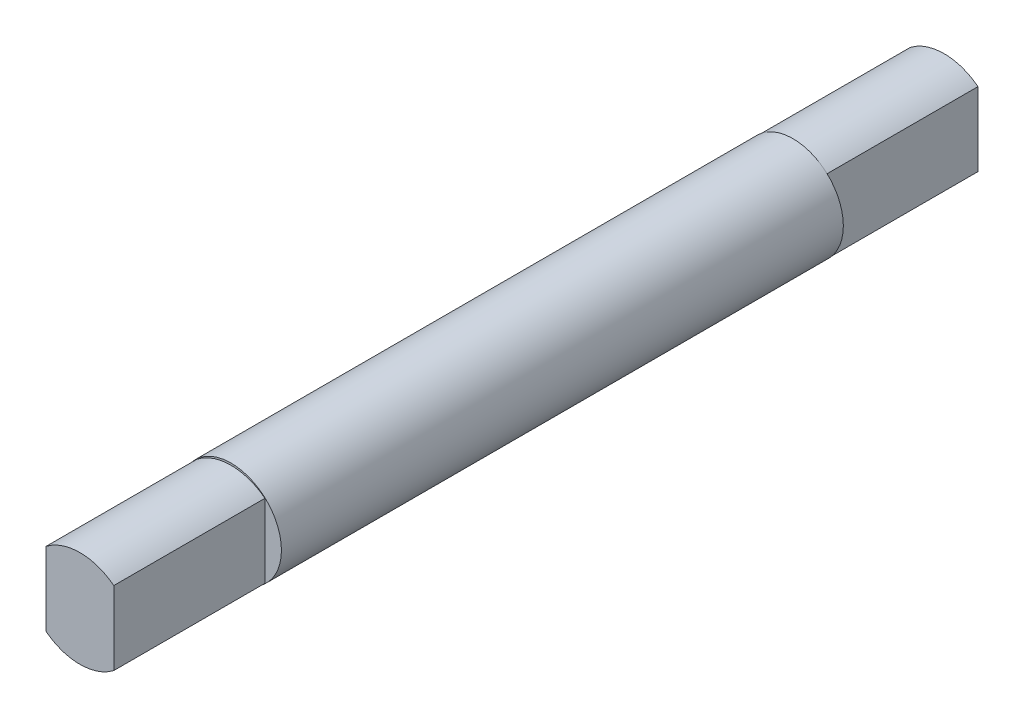
ISO-10303-21;
HEADER;
FILE_DESCRIPTION(('STEP AP214'),'2;1');
FILE_NAME('part.step','',(''),(''),'','','');
FILE_SCHEMA(('AUTOMOTIVE_DESIGN { 1 0 10303 214 1 1 1 1 }'));
ENDSEC;
DATA;
#1=APPLICATION_CONTEXT('core data for automotive mechanical design processes');
#2=APPLICATION_PROTOCOL_DEFINITION('international standard','automotive_design',2000,#1);
#3=PRODUCT_CONTEXT('',#1,'mechanical');
#4=PRODUCT('Part','Part','',(#3));
#5=PRODUCT_RELATED_PRODUCT_CATEGORY('part','',(#4));
#6=PRODUCT_DEFINITION_FORMATION('','',#4);
#7=PRODUCT_DEFINITION_CONTEXT('part definition',#1,'design');
#8=PRODUCT_DEFINITION('design','',#6,#7);
#9=PRODUCT_DEFINITION_SHAPE('','',#8);
#10=(LENGTH_UNIT() NAMED_UNIT(*) SI_UNIT(.MILLI.,.METRE.));
#11=(NAMED_UNIT(*) PLANE_ANGLE_UNIT() SI_UNIT($,.RADIAN.));
#12=(NAMED_UNIT(*) SI_UNIT($,.STERADIAN.) SOLID_ANGLE_UNIT());
#13=UNCERTAINTY_MEASURE_WITH_UNIT(LENGTH_MEASURE(1.E-05),#10,'distance_accuracy_value','');
#14=(GEOMETRIC_REPRESENTATION_CONTEXT(3) GLOBAL_UNCERTAINTY_ASSIGNED_CONTEXT((#13)) GLOBAL_UNIT_ASSIGNED_CONTEXT((#10,
#11,#12)) REPRESENTATION_CONTEXT('',''));
#15=CARTESIAN_POINT('',(0.,0.,0.));
#16=DIRECTION('',(0.,0.,1.));
#17=DIRECTION('',(1.,0.,0.));
#18=AXIS2_PLACEMENT_3D('',#15,#16,#17);
#19=CARTESIAN_POINT('',(0.,0.,0.));
#20=DIRECTION('',(0.,0.,1.));
#21=DIRECTION('',(1.,0.,0.));
#22=AXIS2_PLACEMENT_3D('',#19,#20,#21);
#23=PLANE('',#22);
#24=CARTESIAN_POINT('',(0.,0.,0.));
#25=DIRECTION('',(0.,0.,1.));
#26=DIRECTION('',(1.,0.,0.));
#27=AXIS2_PLACEMENT_3D('',#24,#25,#26);
#28=CIRCLE('',#27,2.6);
#29=CARTESIAN_POINT('',(2.6,0.,0.));
#30=VERTEX_POINT('',#29);
#31=EDGE_CURVE('E11',#30,#30,#28,.T.);
#32=ORIENTED_EDGE('',*,*,#31,.T.);
#33=EDGE_LOOP('',(#32));
#34=FACE_BOUND('',#33,.T.);
#35=DIRECTION('',(0.,-1.,0.));
#36=VECTOR('',#35,1.);
#37=CARTESIAN_POINT('',(-1.75,1.9,0.));
#38=LINE('',#37,#36);
#39=CARTESIAN_POINT('',(-1.75,1.9,0.));
#40=VERTEX_POINT('',#39);
#41=CARTESIAN_POINT('',(-1.75,-1.9,0.));
#42=VERTEX_POINT('',#41);
#43=EDGE_CURVE('E137',#40,#42,#38,.T.);
#44=ORIENTED_EDGE('',*,*,#43,.F.);
#45=CARTESIAN_POINT('',(0.,-0.352083333333338,0.));
#46=DIRECTION('',(0.,0.,-1.));
#47=DIRECTION('',(-1.,0.,0.));
#48=AXIS2_PLACEMENT_3D('',#45,#46,#47);
#49=CIRCLE('',#48,2.85208333333334);
#50=CARTESIAN_POINT('',(1.75,1.9,0.));
#51=VERTEX_POINT('',#50);
#52=EDGE_CURVE('E50',#40,#51,#49,.T.);
#53=ORIENTED_EDGE('',*,*,#52,.T.);
#54=DIRECTION('',(0.,-1.,0.));
#55=VECTOR('',#54,1.);
#56=CARTESIAN_POINT('',(1.75,1.9,0.));
#57=LINE('',#56,#55);
#58=CARTESIAN_POINT('',(1.75,-1.9,0.));
#59=VERTEX_POINT('',#58);
#60=EDGE_CURVE('E55',#51,#59,#57,.T.);
#61=ORIENTED_EDGE('',*,*,#60,.T.);
#62=CARTESIAN_POINT('',(0.,0.352083333333334,0.));
#63=DIRECTION('',(0.,0.,1.));
#64=DIRECTION('',(1.,0.,0.));
#65=AXIS2_PLACEMENT_3D('',#62,#63,#64);
#66=CIRCLE('',#65,2.85208333333333);
#67=EDGE_CURVE('E147',#42,#59,#66,.T.);
#68=ORIENTED_EDGE('',*,*,#67,.F.);
#69=EDGE_LOOP('',(#44,#53,#61,#68));
#70=FACE_BOUND('',#69,.T.);
#71=ADVANCED_FACE('F35',(#34,#70),#23,.T.);
#72=CARTESIAN_POINT('',(0.,0.,0.));
#73=DIRECTION('',(0.,0.,1.));
#74=DIRECTION('',(1.,0.,0.));
#75=AXIS2_PLACEMENT_3D('',#72,#73,#74);
#76=CYLINDRICAL_SURFACE('',#75,2.6);
#77=ORIENTED_EDGE('',*,*,#31,.F.);
#78=EDGE_LOOP('',(#77));
#79=FACE_BOUND('',#78,.T.);
#80=CARTESIAN_POINT('',(0.,0.,-29.));
#81=DIRECTION('',(0.,0.,1.));
#82=DIRECTION('',(1.,0.,0.));
#83=AXIS2_PLACEMENT_3D('',#80,#81,#82);
#84=CIRCLE('',#83,2.6);
#85=CARTESIAN_POINT('',(2.6,0.,-29.));
#86=VERTEX_POINT('',#85);
#87=EDGE_CURVE('E129',#86,#86,#84,.T.);
#88=ORIENTED_EDGE('',*,*,#87,.T.);
#89=EDGE_LOOP('',(#88));
#90=FACE_BOUND('',#89,.T.);
#91=ADVANCED_FACE('F37',(#79,#90),#76,.T.);
#92=CARTESIAN_POINT('',(0.,-0.352083333333338,7.8));
#93=DIRECTION('',(0.,0.,-1.));
#94=DIRECTION('',(-1.,0.,0.));
#95=AXIS2_PLACEMENT_3D('',#92,#93,#94);
#96=CYLINDRICAL_SURFACE('',#95,2.85208333333334);
#97=ORIENTED_EDGE('',*,*,#52,.F.);
#98=DIRECTION('',(0.,0.,-1.));
#99=VECTOR('',#98,1.);
#100=CARTESIAN_POINT('',(-1.75,1.9,7.8));
#101=LINE('',#100,#99);
#102=CARTESIAN_POINT('',(-1.75,1.9,7.8));
#103=VERTEX_POINT('',#102);
#104=EDGE_CURVE('E43',#103,#40,#101,.T.);
#105=ORIENTED_EDGE('',*,*,#104,.F.);
#106=CARTESIAN_POINT('',(0.,-0.352083333333338,7.8));
#107=DIRECTION('',(0.,0.,-1.));
#108=DIRECTION('',(-1.,0.,0.));
#109=AXIS2_PLACEMENT_3D('',#106,#107,#108);
#110=CIRCLE('',#109,2.85208333333334);
#111=CARTESIAN_POINT('',(1.75,1.9,7.8));
#112=VERTEX_POINT('',#111);
#113=EDGE_CURVE('E133',#103,#112,#110,.T.);
#114=ORIENTED_EDGE('',*,*,#113,.T.);
#115=DIRECTION('',(0.,0.,-1.));
#116=VECTOR('',#115,1.);
#117=CARTESIAN_POINT('',(1.75,1.9,7.8));
#118=LINE('',#117,#116);
#119=EDGE_CURVE('E144',#112,#51,#118,.T.);
#120=ORIENTED_EDGE('',*,*,#119,.T.);
#121=EDGE_LOOP('',(#97,#105,#114,#120));
#122=FACE_BOUND('',#121,.T.);
#123=ADVANCED_FACE('F159',(#122),#96,.T.);
#124=CARTESIAN_POINT('',(-1.75,1.9,7.8));
#125=DIRECTION('',(1.,0.,0.));
#126=DIRECTION('',(0.,1.,0.));
#127=AXIS2_PLACEMENT_3D('',#124,#125,#126);
#128=PLANE('',#127);
#129=ORIENTED_EDGE('',*,*,#43,.T.);
#130=DIRECTION('',(0.,0.,-1.));
#131=VECTOR('',#130,1.);
#132=CARTESIAN_POINT('',(-1.75,-1.9,7.8));
#133=LINE('',#132,#131);
#134=CARTESIAN_POINT('',(-1.75,-1.9,7.8));
#135=VERTEX_POINT('',#134);
#136=EDGE_CURVE('E154',#135,#42,#133,.T.);
#137=ORIENTED_EDGE('',*,*,#136,.F.);
#138=DIRECTION('',(0.,-1.,0.));
#139=VECTOR('',#138,1.);
#140=CARTESIAN_POINT('',(-1.75,1.9,7.8));
#141=LINE('',#140,#139);
#142=EDGE_CURVE('E142',#103,#135,#141,.T.);
#143=ORIENTED_EDGE('',*,*,#142,.F.);
#144=ORIENTED_EDGE('',*,*,#104,.T.);
#145=EDGE_LOOP('',(#129,#137,#143,#144));
#146=FACE_BOUND('',#145,.T.);
#147=ADVANCED_FACE('F170',(#146),#128,.F.);
#148=CARTESIAN_POINT('',(0.,0.352083333333334,7.8));
#149=DIRECTION('',(0.,0.,-1.));
#150=DIRECTION('',(-1.,0.,0.));
#151=AXIS2_PLACEMENT_3D('',#148,#149,#150);
#152=CYLINDRICAL_SURFACE('',#151,2.85208333333333);
#153=ORIENTED_EDGE('',*,*,#67,.T.);
#154=DIRECTION('',(0.,0.,-1.));
#155=VECTOR('',#154,1.);
#156=CARTESIAN_POINT('',(1.75,-1.9,7.8));
#157=LINE('',#156,#155);
#158=CARTESIAN_POINT('',(1.75,-1.9,7.8));
#159=VERTEX_POINT('',#158);
#160=EDGE_CURVE('E157',#159,#59,#157,.T.);
#161=ORIENTED_EDGE('',*,*,#160,.F.);
#162=CARTESIAN_POINT('',(0.,0.352083333333334,7.8));
#163=DIRECTION('',(0.,0.,1.));
#164=DIRECTION('',(1.,0.,0.));
#165=AXIS2_PLACEMENT_3D('',#162,#163,#164);
#166=CIRCLE('',#165,2.85208333333333);
#167=EDGE_CURVE('E140',#135,#159,#166,.T.);
#168=ORIENTED_EDGE('',*,*,#167,.F.);
#169=ORIENTED_EDGE('',*,*,#136,.T.);
#170=EDGE_LOOP('',(#153,#161,#168,#169));
#171=FACE_BOUND('',#170,.T.);
#172=ADVANCED_FACE('F167',(#171),#152,.T.);
#173=CARTESIAN_POINT('',(1.75,1.9,7.8));
#174=DIRECTION('',(1.,0.,0.));
#175=DIRECTION('',(0.,1.,0.));
#176=AXIS2_PLACEMENT_3D('',#173,#174,#175);
#177=PLANE('',#176);
#178=ORIENTED_EDGE('',*,*,#60,.F.);
#179=ORIENTED_EDGE('',*,*,#119,.F.);
#180=DIRECTION('',(0.,-1.,0.));
#181=VECTOR('',#180,1.);
#182=CARTESIAN_POINT('',(1.75,1.9,7.8));
#183=LINE('',#182,#181);
#184=EDGE_CURVE('E136',#112,#159,#183,.T.);
#185=ORIENTED_EDGE('',*,*,#184,.T.);
#186=ORIENTED_EDGE('',*,*,#160,.T.);
#187=EDGE_LOOP('',(#178,#179,#185,#186));
#188=FACE_BOUND('',#187,.T.);
#189=ADVANCED_FACE('F163',(#188),#177,.T.);
#190=CARTESIAN_POINT('',(0.,-0.352083333333338,7.8));
#191=DIRECTION('',(0.,0.,-1.));
#192=DIRECTION('',(-1.,0.,0.));
#193=AXIS2_PLACEMENT_3D('',#190,#191,#192);
#194=PLANE('',#193);
#195=ORIENTED_EDGE('',*,*,#113,.F.);
#196=ORIENTED_EDGE('',*,*,#142,.T.);
#197=ORIENTED_EDGE('',*,*,#167,.T.);
#198=ORIENTED_EDGE('',*,*,#184,.F.);
#199=EDGE_LOOP('',(#195,#196,#197,#198));
#200=FACE_BOUND('',#199,.T.);
#201=ADVANCED_FACE('F173',(#200),#194,.F.);
#202=CARTESIAN_POINT('',(0.,0.,-29.));
#203=DIRECTION('',(0.,0.,-1.));
#204=DIRECTION('',(1.,0.,0.));
#205=AXIS2_PLACEMENT_3D('',#202,#203,#204);
#206=PLANE('',#205);
#207=ORIENTED_EDGE('',*,*,#87,.F.);
#208=EDGE_LOOP('',(#207));
#209=FACE_BOUND('',#208,.T.);
#210=DIRECTION('',(0.,-1.,0.));
#211=VECTOR('',#210,1.);
#212=CARTESIAN_POINT('',(-1.75,1.9,-29.));
#213=LINE('',#212,#211);
#214=CARTESIAN_POINT('',(-1.75,1.9,-29.));
#215=VERTEX_POINT('',#214);
#216=CARTESIAN_POINT('',(-1.75,-1.9,-29.));
#217=VERTEX_POINT('',#216);
#218=EDGE_CURVE('E117',#215,#217,#213,.T.);
#219=ORIENTED_EDGE('',*,*,#218,.T.);
#220=CARTESIAN_POINT('',(0.,0.352083333333334,-29.));
#221=DIRECTION('',(0.,0.,1.));
#222=DIRECTION('',(1.,0.,0.));
#223=AXIS2_PLACEMENT_3D('',#220,#221,#222);
#224=CIRCLE('',#223,2.85208333333333);
#225=CARTESIAN_POINT('',(1.75,-1.9,-29.));
#226=VERTEX_POINT('',#225);
#227=EDGE_CURVE('E286',#217,#226,#224,.T.);
#228=ORIENTED_EDGE('',*,*,#227,.T.);
#229=DIRECTION('',(0.,-1.,0.));
#230=VECTOR('',#229,1.);
#231=CARTESIAN_POINT('',(1.75,1.9,-29.));
#232=LINE('',#231,#230);
#233=CARTESIAN_POINT('',(1.75,1.9,-29.));
#234=VERTEX_POINT('',#233);
#235=EDGE_CURVE('E289',#234,#226,#232,.T.);
#236=ORIENTED_EDGE('',*,*,#235,.F.);
#237=CARTESIAN_POINT('',(0.,-0.352083333333338,-29.));
#238=DIRECTION('',(0.,0.,-1.));
#239=DIRECTION('',(-1.,0.,0.));
#240=AXIS2_PLACEMENT_3D('',#237,#238,#239);
#241=CIRCLE('',#240,2.85208333333334);
#242=EDGE_CURVE('E121',#215,#234,#241,.T.);
#243=ORIENTED_EDGE('',*,*,#242,.F.);
#244=EDGE_LOOP('',(#219,#228,#236,#243));
#245=FACE_BOUND('',#244,.T.);
#246=ADVANCED_FACE('F175',(#209,#245),#206,.T.);
#247=CARTESIAN_POINT('',(0.,-0.352083333333338,-36.8));
#248=DIRECTION('',(0.,0.,1.));
#249=DIRECTION('',(-1.,0.,0.));
#250=AXIS2_PLACEMENT_3D('',#247,#248,#249);
#251=CYLINDRICAL_SURFACE('',#250,2.85208333333334);
#252=ORIENTED_EDGE('',*,*,#242,.T.);
#253=DIRECTION('',(0.,0.,1.));
#254=VECTOR('',#253,1.);
#255=CARTESIAN_POINT('',(1.75,1.9,-36.8));
#256=LINE('',#255,#254);
#257=CARTESIAN_POINT('',(1.75,1.9,-36.8));
#258=VERTEX_POINT('',#257);
#259=EDGE_CURVE('E103',#258,#234,#256,.T.);
#260=ORIENTED_EDGE('',*,*,#259,.F.);
#261=CARTESIAN_POINT('',(0.,-0.352083333333338,-36.8));
#262=DIRECTION('',(0.,0.,-1.));
#263=DIRECTION('',(-1.,0.,0.));
#264=AXIS2_PLACEMENT_3D('',#261,#262,#263);
#265=CIRCLE('',#264,2.85208333333334);
#266=CARTESIAN_POINT('',(-1.75,1.9,-36.8));
#267=VERTEX_POINT('',#266);
#268=EDGE_CURVE('E109',#267,#258,#265,.T.);
#269=ORIENTED_EDGE('',*,*,#268,.F.);
#270=DIRECTION('',(0.,0.,1.));
#271=VECTOR('',#270,1.);
#272=CARTESIAN_POINT('',(-1.75,1.9,-36.8));
#273=LINE('',#272,#271);
#274=EDGE_CURVE('E132',#267,#215,#273,.T.);
#275=ORIENTED_EDGE('',*,*,#274,.T.);
#276=EDGE_LOOP('',(#252,#260,#269,#275));
#277=FACE_BOUND('',#276,.T.);
#278=ADVANCED_FACE('F119',(#277),#251,.T.);
#279=CARTESIAN_POINT('',(-1.75,1.9,-36.8));
#280=DIRECTION('',(1.,0.,0.));
#281=DIRECTION('',(0.,1.,0.));
#282=AXIS2_PLACEMENT_3D('',#279,#280,#281);
#283=PLANE('',#282);
#284=ORIENTED_EDGE('',*,*,#218,.F.);
#285=ORIENTED_EDGE('',*,*,#274,.F.);
#286=DIRECTION('',(0.,-1.,0.));
#287=VECTOR('',#286,1.);
#288=CARTESIAN_POINT('',(-1.75,1.9,-36.8));
#289=LINE('',#288,#287);
#290=CARTESIAN_POINT('',(-1.75,-1.9,-36.8));
#291=VERTEX_POINT('',#290);
#292=EDGE_CURVE('E114',#267,#291,#289,.T.);
#293=ORIENTED_EDGE('',*,*,#292,.T.);
#294=DIRECTION('',(0.,0.,1.));
#295=VECTOR('',#294,1.);
#296=CARTESIAN_POINT('',(-1.75,-1.9,-36.8));
#297=LINE('',#296,#295);
#298=EDGE_CURVE('E124',#291,#217,#297,.T.);
#299=ORIENTED_EDGE('',*,*,#298,.T.);
#300=EDGE_LOOP('',(#284,#285,#293,#299));
#301=FACE_BOUND('',#300,.T.);
#302=ADVANCED_FACE('F244',(#301),#283,.F.);
#303=CARTESIAN_POINT('',(0.,0.352083333333334,-36.8));
#304=DIRECTION('',(0.,0.,1.));
#305=DIRECTION('',(-1.,0.,0.));
#306=AXIS2_PLACEMENT_3D('',#303,#304,#305);
#307=CYLINDRICAL_SURFACE('',#306,2.85208333333333);
#308=ORIENTED_EDGE('',*,*,#227,.F.);
#309=ORIENTED_EDGE('',*,*,#298,.F.);
#310=CARTESIAN_POINT('',(0.,0.352083333333334,-36.8));
#311=DIRECTION('',(0.,0.,1.));
#312=DIRECTION('',(1.,0.,0.));
#313=AXIS2_PLACEMENT_3D('',#310,#311,#312);
#314=CIRCLE('',#313,2.85208333333333);
#315=CARTESIAN_POINT('',(1.75,-1.9,-36.8));
#316=VERTEX_POINT('',#315);
#317=EDGE_CURVE('E108',#291,#316,#314,.T.);
#318=ORIENTED_EDGE('',*,*,#317,.T.);
#319=DIRECTION('',(0.,0.,1.));
#320=VECTOR('',#319,1.);
#321=CARTESIAN_POINT('',(1.75,-1.9,-36.8));
#322=LINE('',#321,#320);
#323=EDGE_CURVE('E105',#316,#226,#322,.T.);
#324=ORIENTED_EDGE('',*,*,#323,.T.);
#325=EDGE_LOOP('',(#308,#309,#318,#324));
#326=FACE_BOUND('',#325,.T.);
#327=ADVANCED_FACE('F252',(#326),#307,.T.);
#328=CARTESIAN_POINT('',(1.75,1.9,-36.8));
#329=DIRECTION('',(1.,0.,0.));
#330=DIRECTION('',(0.,1.,0.));
#331=AXIS2_PLACEMENT_3D('',#328,#329,#330);
#332=PLANE('',#331);
#333=ORIENTED_EDGE('',*,*,#235,.T.);
#334=ORIENTED_EDGE('',*,*,#323,.F.);
#335=DIRECTION('',(0.,-1.,0.));
#336=VECTOR('',#335,1.);
#337=CARTESIAN_POINT('',(1.75,1.9,-36.8));
#338=LINE('',#337,#336);
#339=EDGE_CURVE('E98',#258,#316,#338,.T.);
#340=ORIENTED_EDGE('',*,*,#339,.F.);
#341=ORIENTED_EDGE('',*,*,#259,.T.);
#342=EDGE_LOOP('',(#333,#334,#340,#341));
#343=FACE_BOUND('',#342,.T.);
#344=ADVANCED_FACE('F101',(#343),#332,.T.);
#345=CARTESIAN_POINT('',(0.,-0.352083333333338,-36.8));
#346=DIRECTION('',(0.,0.,1.));
#347=DIRECTION('',(-1.,0.,0.));
#348=AXIS2_PLACEMENT_3D('',#345,#346,#347);
#349=PLANE('',#348);
#350=ORIENTED_EDGE('',*,*,#268,.T.);
#351=ORIENTED_EDGE('',*,*,#339,.T.);
#352=ORIENTED_EDGE('',*,*,#317,.F.);
#353=ORIENTED_EDGE('',*,*,#292,.F.);
#354=EDGE_LOOP('',(#350,#351,#352,#353));
#355=FACE_BOUND('',#354,.T.);
#356=ADVANCED_FACE('F112',(#355),#349,.F.);
#357=CLOSED_SHELL('',(#71,#91,#123,#147,#172,#189,#201,#246,#278,#302,#327,#344,#356));
#358=MANIFOLD_SOLID_BREP('B2',#357);
#359=ADVANCED_BREP_SHAPE_REPRESENTATION('',(#18,#358),#14);
#360=SHAPE_DEFINITION_REPRESENTATION(#9,#359);
ENDSEC;
END-ISO-10303-21;
